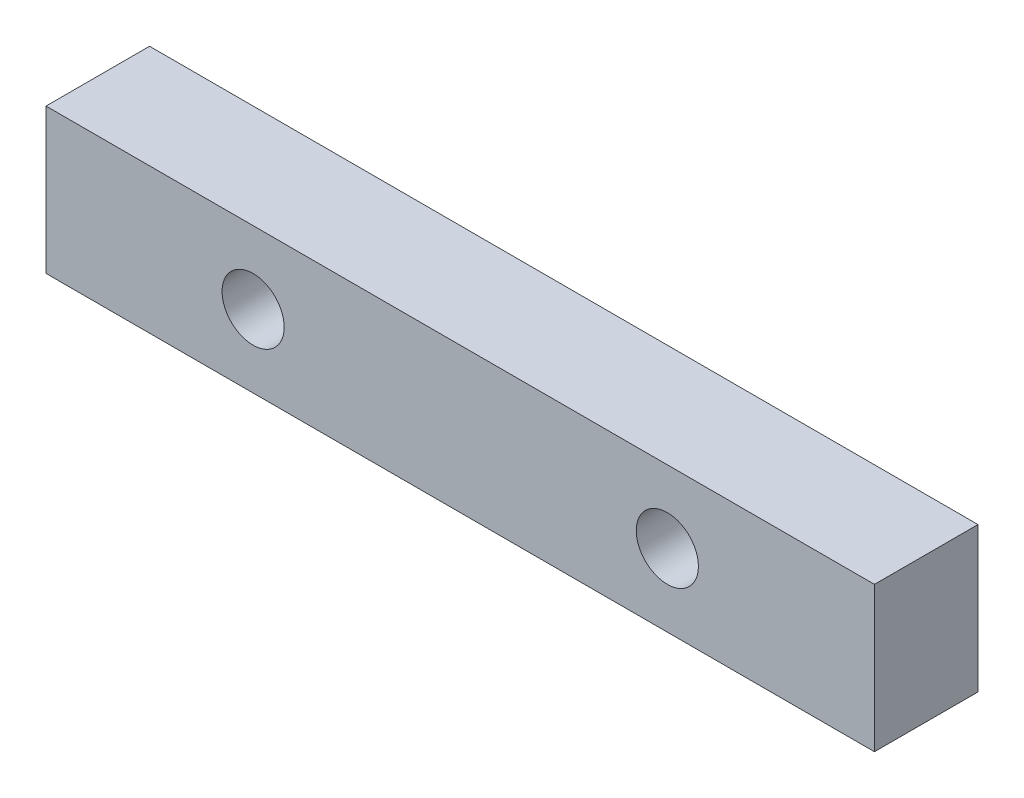
ISO-10303-21;
HEADER;
FILE_DESCRIPTION(('STEP AP214'),'2;1');
FILE_NAME('part.step','',(''),(''),'','','');
FILE_SCHEMA(('AUTOMOTIVE_DESIGN { 1 0 10303 214 1 1 1 1 }'));
ENDSEC;
DATA;
#1=APPLICATION_CONTEXT('core data for automotive mechanical design processes');
#2=APPLICATION_PROTOCOL_DEFINITION('international standard','automotive_design',2000,#1);
#3=PRODUCT_CONTEXT('',#1,'mechanical');
#4=PRODUCT('Part','Part','',(#3));
#5=PRODUCT_RELATED_PRODUCT_CATEGORY('part','',(#4));
#6=PRODUCT_DEFINITION_FORMATION('','',#4);
#7=PRODUCT_DEFINITION_CONTEXT('part definition',#1,'design');
#8=PRODUCT_DEFINITION('design','',#6,#7);
#9=PRODUCT_DEFINITION_SHAPE('','',#8);
#10=(LENGTH_UNIT() NAMED_UNIT(*) SI_UNIT(.MILLI.,.METRE.));
#11=(NAMED_UNIT(*) PLANE_ANGLE_UNIT() SI_UNIT($,.RADIAN.));
#12=(NAMED_UNIT(*) SI_UNIT($,.STERADIAN.) SOLID_ANGLE_UNIT());
#13=UNCERTAINTY_MEASURE_WITH_UNIT(LENGTH_MEASURE(1.E-05),#10,'distance_accuracy_value','');
#14=(GEOMETRIC_REPRESENTATION_CONTEXT(3) GLOBAL_UNCERTAINTY_ASSIGNED_CONTEXT((#13)) GLOBAL_UNIT_ASSIGNED_CONTEXT((#10,
#11,#12)) REPRESENTATION_CONTEXT('',''));
#15=CARTESIAN_POINT('',(0.,0.,0.));
#16=DIRECTION('',(0.,0.,1.));
#17=DIRECTION('',(1.,0.,0.));
#18=AXIS2_PLACEMENT_3D('',#15,#16,#17);
#19=CARTESIAN_POINT('',(0.,0.,5.));
#20=DIRECTION('',(0.,0.,-1.));
#21=DIRECTION('',(-1.,0.,0.));
#22=AXIS2_PLACEMENT_3D('',#19,#20,#21);
#23=PLANE('',#22);
#24=DIRECTION('',(0.,1.,0.));
#25=VECTOR('',#24,1.);
#26=CARTESIAN_POINT('',(20.,-3.5,5.));
#27=LINE('',#26,#25);
#28=CARTESIAN_POINT('',(20.,-3.5,5.));
#29=VERTEX_POINT('',#28);
#30=CARTESIAN_POINT('',(20.,3.5,5.));
#31=VERTEX_POINT('',#30);
#32=EDGE_CURVE('E85',#29,#31,#27,.T.);
#33=ORIENTED_EDGE('',*,*,#32,.T.);
#34=DIRECTION('',(-1.,0.,0.));
#35=VECTOR('',#34,1.);
#36=CARTESIAN_POINT('',(-20.,3.5,5.));
#37=LINE('',#36,#35);
#38=CARTESIAN_POINT('',(-20.,3.5,5.));
#39=VERTEX_POINT('',#38);
#40=EDGE_CURVE('E80',#31,#39,#37,.T.);
#41=ORIENTED_EDGE('',*,*,#40,.T.);
#42=DIRECTION('',(0.,-1.,0.));
#43=VECTOR('',#42,1.);
#44=CARTESIAN_POINT('',(-20.,-3.5,5.));
#45=LINE('',#44,#43);
#46=CARTESIAN_POINT('',(-20.,-3.5,5.));
#47=VERTEX_POINT('',#46);
#48=EDGE_CURVE('E83',#39,#47,#45,.T.);
#49=ORIENTED_EDGE('',*,*,#48,.T.);
#50=DIRECTION('',(1.,0.,0.));
#51=VECTOR('',#50,1.);
#52=CARTESIAN_POINT('',(-20.,-3.5,5.));
#53=LINE('',#52,#51);
#54=EDGE_CURVE('E50',#47,#29,#53,.T.);
#55=ORIENTED_EDGE('',*,*,#54,.T.);
#56=EDGE_LOOP('',(#33,#41,#49,#55));
#57=FACE_BOUND('',#56,.T.);
#58=CARTESIAN_POINT('',(-10.,0.,5.));
#59=DIRECTION('',(0.,0.,1.));
#60=DIRECTION('',(1.,0.,0.));
#61=AXIS2_PLACEMENT_3D('',#58,#59,#60);
#62=CIRCLE('',#61,1.5);
#63=CARTESIAN_POINT('',(-8.5,0.,5.));
#64=VERTEX_POINT('',#63);
#65=EDGE_CURVE('E100',#64,#64,#62,.T.);
#66=ORIENTED_EDGE('',*,*,#65,.F.);
#67=EDGE_LOOP('',(#66));
#68=FACE_BOUND('',#67,.T.);
#69=CARTESIAN_POINT('',(10.,0.,5.));
#70=DIRECTION('',(0.,0.,1.));
#71=DIRECTION('',(1.,0.,0.));
#72=AXIS2_PLACEMENT_3D('',#69,#70,#71);
#73=CIRCLE('',#72,1.5);
#74=CARTESIAN_POINT('',(11.5,0.,5.));
#75=VERTEX_POINT('',#74);
#76=EDGE_CURVE('E115',#75,#75,#73,.T.);
#77=ORIENTED_EDGE('',*,*,#76,.F.);
#78=EDGE_LOOP('',(#77));
#79=FACE_BOUND('',#78,.T.);
#80=ADVANCED_FACE('F33',(#57,#68,#79),#23,.F.);
#81=CARTESIAN_POINT('',(0.,0.,0.));
#82=DIRECTION('',(0.,0.,-1.));
#83=DIRECTION('',(-1.,0.,0.));
#84=AXIS2_PLACEMENT_3D('',#81,#82,#83);
#85=PLANE('',#84);
#86=CARTESIAN_POINT('',(-10.,0.,0.));
#87=DIRECTION('',(0.,0.,1.));
#88=DIRECTION('',(1.,0.,0.));
#89=AXIS2_PLACEMENT_3D('',#86,#87,#88);
#90=CIRCLE('',#89,1.5);
#91=CARTESIAN_POINT('',(-8.5,0.,0.));
#92=VERTEX_POINT('',#91);
#93=EDGE_CURVE('E112',#92,#92,#90,.T.);
#94=ORIENTED_EDGE('',*,*,#93,.T.);
#95=EDGE_LOOP('',(#94));
#96=FACE_BOUND('',#95,.T.);
#97=DIRECTION('',(0.,1.,0.));
#98=VECTOR('',#97,1.);
#99=CARTESIAN_POINT('',(20.,-3.5,0.));
#100=LINE('',#99,#98);
#101=CARTESIAN_POINT('',(20.,-3.5,0.));
#102=VERTEX_POINT('',#101);
#103=CARTESIAN_POINT('',(20.,3.5,0.));
#104=VERTEX_POINT('',#103);
#105=EDGE_CURVE('E97',#102,#104,#100,.T.);
#106=ORIENTED_EDGE('',*,*,#105,.F.);
#107=DIRECTION('',(1.,0.,0.));
#108=VECTOR('',#107,1.);
#109=CARTESIAN_POINT('',(-20.,-3.5,0.));
#110=LINE('',#109,#108);
#111=CARTESIAN_POINT('',(-20.,-3.5,0.));
#112=VERTEX_POINT('',#111);
#113=EDGE_CURVE('E73',#112,#102,#110,.T.);
#114=ORIENTED_EDGE('',*,*,#113,.F.);
#115=DIRECTION('',(0.,-1.,0.));
#116=VECTOR('',#115,1.);
#117=CARTESIAN_POINT('',(-20.,-3.5,0.));
#118=LINE('',#117,#116);
#119=CARTESIAN_POINT('',(-20.,3.5,0.));
#120=VERTEX_POINT('',#119);
#121=EDGE_CURVE('E67',#120,#112,#118,.T.);
#122=ORIENTED_EDGE('',*,*,#121,.F.);
#123=DIRECTION('',(-1.,0.,0.));
#124=VECTOR('',#123,1.);
#125=CARTESIAN_POINT('',(-20.,3.5,0.));
#126=LINE('',#125,#124);
#127=EDGE_CURVE('E89',#104,#120,#126,.T.);
#128=ORIENTED_EDGE('',*,*,#127,.F.);
#129=EDGE_LOOP('',(#106,#114,#122,#128));
#130=FACE_BOUND('',#129,.T.);
#131=CARTESIAN_POINT('',(10.,0.,0.));
#132=DIRECTION('',(0.,0.,1.));
#133=DIRECTION('',(1.,0.,0.));
#134=AXIS2_PLACEMENT_3D('',#131,#132,#133);
#135=CIRCLE('',#134,1.5);
#136=CARTESIAN_POINT('',(11.5,0.,0.));
#137=VERTEX_POINT('',#136);
#138=EDGE_CURVE('E118',#137,#137,#135,.T.);
#139=ORIENTED_EDGE('',*,*,#138,.T.);
#140=EDGE_LOOP('',(#139));
#141=FACE_BOUND('',#140,.T.);
#142=ADVANCED_FACE('F108',(#96,#130,#141),#85,.T.);
#143=CARTESIAN_POINT('',(20.,-3.5,5.));
#144=DIRECTION('',(-1.,0.,0.));
#145=DIRECTION('',(0.,0.,1.));
#146=AXIS2_PLACEMENT_3D('',#143,#144,#145);
#147=PLANE('',#146);
#148=ORIENTED_EDGE('',*,*,#105,.T.);
#149=DIRECTION('',(0.,0.,-1.));
#150=VECTOR('',#149,1.);
#151=CARTESIAN_POINT('',(20.,3.5,5.));
#152=LINE('',#151,#150);
#153=EDGE_CURVE('E11',#31,#104,#152,.T.);
#154=ORIENTED_EDGE('',*,*,#153,.F.);
#155=ORIENTED_EDGE('',*,*,#32,.F.);
#156=DIRECTION('',(0.,0.,-1.));
#157=VECTOR('',#156,1.);
#158=CARTESIAN_POINT('',(20.,-3.5,5.));
#159=LINE('',#158,#157);
#160=EDGE_CURVE('E93',#29,#102,#159,.T.);
#161=ORIENTED_EDGE('',*,*,#160,.T.);
#162=EDGE_LOOP('',(#148,#154,#155,#161));
#163=FACE_BOUND('',#162,.T.);
#164=ADVANCED_FACE('F35',(#163),#147,.F.);
#165=CARTESIAN_POINT('',(-20.,3.5,5.));
#166=DIRECTION('',(0.,-1.,0.));
#167=DIRECTION('',(0.,0.,-1.));
#168=AXIS2_PLACEMENT_3D('',#165,#166,#167);
#169=PLANE('',#168);
#170=ORIENTED_EDGE('',*,*,#127,.T.);
#171=DIRECTION('',(0.,0.,-1.));
#172=VECTOR('',#171,1.);
#173=CARTESIAN_POINT('',(-20.,3.5,5.));
#174=LINE('',#173,#172);
#175=EDGE_CURVE('E42',#39,#120,#174,.T.);
#176=ORIENTED_EDGE('',*,*,#175,.F.);
#177=ORIENTED_EDGE('',*,*,#40,.F.);
#178=ORIENTED_EDGE('',*,*,#153,.T.);
#179=EDGE_LOOP('',(#170,#176,#177,#178));
#180=FACE_BOUND('',#179,.T.);
#181=ADVANCED_FACE('F88',(#180),#169,.F.);
#182=CARTESIAN_POINT('',(-20.,-3.5,5.));
#183=DIRECTION('',(1.,0.,0.));
#184=DIRECTION('',(0.,0.,-1.));
#185=AXIS2_PLACEMENT_3D('',#182,#183,#184);
#186=PLANE('',#185);
#187=ORIENTED_EDGE('',*,*,#121,.T.);
#188=DIRECTION('',(0.,0.,-1.));
#189=VECTOR('',#188,1.);
#190=CARTESIAN_POINT('',(-20.,-3.5,5.));
#191=LINE('',#190,#189);
#192=EDGE_CURVE('E90',#47,#112,#191,.T.);
#193=ORIENTED_EDGE('',*,*,#192,.F.);
#194=ORIENTED_EDGE('',*,*,#48,.F.);
#195=ORIENTED_EDGE('',*,*,#175,.T.);
#196=EDGE_LOOP('',(#187,#193,#194,#195));
#197=FACE_BOUND('',#196,.T.);
#198=ADVANCED_FACE('F91',(#197),#186,.F.);
#199=CARTESIAN_POINT('',(-20.,-3.5,5.));
#200=DIRECTION('',(0.,1.,0.));
#201=DIRECTION('',(0.,0.,1.));
#202=AXIS2_PLACEMENT_3D('',#199,#200,#201);
#203=PLANE('',#202);
#204=ORIENTED_EDGE('',*,*,#113,.T.);
#205=ORIENTED_EDGE('',*,*,#160,.F.);
#206=ORIENTED_EDGE('',*,*,#54,.F.);
#207=ORIENTED_EDGE('',*,*,#192,.T.);
#208=EDGE_LOOP('',(#204,#205,#206,#207));
#209=FACE_BOUND('',#208,.T.);
#210=ADVANCED_FACE('F105',(#209),#203,.F.);
#211=CARTESIAN_POINT('',(-10.,0.,5.));
#212=DIRECTION('',(0.,0.,-1.));
#213=DIRECTION('',(-1.,0.,0.));
#214=AXIS2_PLACEMENT_3D('',#211,#212,#213);
#215=CYLINDRICAL_SURFACE('',#214,1.5);
#216=ORIENTED_EDGE('',*,*,#65,.T.);
#217=EDGE_LOOP('',(#216));
#218=FACE_BOUND('',#217,.T.);
#219=ORIENTED_EDGE('',*,*,#93,.F.);
#220=EDGE_LOOP('',(#219));
#221=FACE_BOUND('',#220,.T.);
#222=ADVANCED_FACE('F135',(#218,#221),#215,.F.);
#223=CARTESIAN_POINT('',(10.,0.,5.));
#224=DIRECTION('',(0.,0.,-1.));
#225=DIRECTION('',(-1.,0.,0.));
#226=AXIS2_PLACEMENT_3D('',#223,#224,#225);
#227=CYLINDRICAL_SURFACE('',#226,1.5);
#228=ORIENTED_EDGE('',*,*,#76,.T.);
#229=EDGE_LOOP('',(#228));
#230=FACE_BOUND('',#229,.T.);
#231=ORIENTED_EDGE('',*,*,#138,.F.);
#232=EDGE_LOOP('',(#231));
#233=FACE_BOUND('',#232,.T.);
#234=ADVANCED_FACE('F124',(#230,#233),#227,.F.);
#235=CLOSED_SHELL('',(#80,#142,#164,#181,#198,#210,#222,#234));
#236=MANIFOLD_SOLID_BREP('B2',#235);
#237=ADVANCED_BREP_SHAPE_REPRESENTATION('',(#18,#236),#14);
#238=SHAPE_DEFINITION_REPRESENTATION(#9,#237);
ENDSEC;
END-ISO-10303-21;
